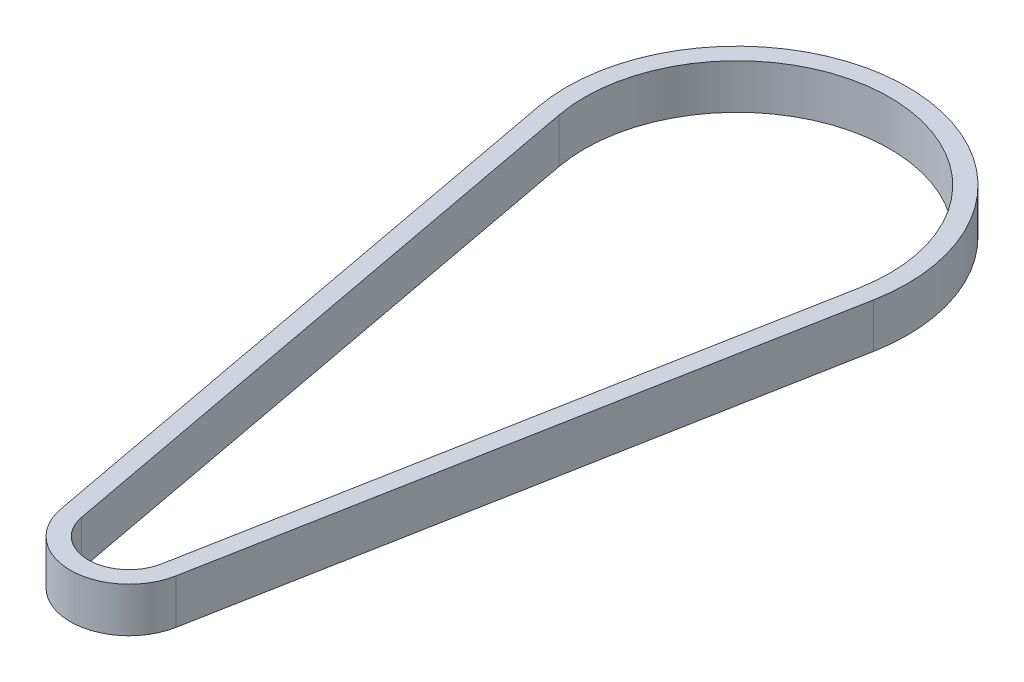
ISO-10303-21;
HEADER;
FILE_DESCRIPTION(('STEP AP214'),'2;1');
FILE_NAME('part.step','',(''),(''),'','','');
FILE_SCHEMA(('AUTOMOTIVE_DESIGN { 1 0 10303 214 1 1 1 1 }'));
ENDSEC;
DATA;
#1=APPLICATION_CONTEXT('core data for automotive mechanical design processes');
#2=APPLICATION_PROTOCOL_DEFINITION('international standard','automotive_design',2000,#1);
#3=PRODUCT_CONTEXT('',#1,'mechanical');
#4=PRODUCT('Part','Part','',(#3));
#5=PRODUCT_RELATED_PRODUCT_CATEGORY('part','',(#4));
#6=PRODUCT_DEFINITION_FORMATION('','',#4);
#7=PRODUCT_DEFINITION_CONTEXT('part definition',#1,'design');
#8=PRODUCT_DEFINITION('design','',#6,#7);
#9=PRODUCT_DEFINITION_SHAPE('','',#8);
#10=(LENGTH_UNIT() NAMED_UNIT(*) SI_UNIT(.MILLI.,.METRE.));
#11=(NAMED_UNIT(*) PLANE_ANGLE_UNIT() SI_UNIT($,.RADIAN.));
#12=(NAMED_UNIT(*) SI_UNIT($,.STERADIAN.) SOLID_ANGLE_UNIT());
#13=UNCERTAINTY_MEASURE_WITH_UNIT(LENGTH_MEASURE(1.E-05),#10,'distance_accuracy_value','');
#14=(GEOMETRIC_REPRESENTATION_CONTEXT(3) GLOBAL_UNCERTAINTY_ASSIGNED_CONTEXT((#13)) GLOBAL_UNIT_ASSIGNED_CONTEXT((#10,
#11,#12)) REPRESENTATION_CONTEXT('',''));
#15=CARTESIAN_POINT('',(0.,0.,0.));
#16=DIRECTION('',(0.,0.,1.));
#17=DIRECTION('',(1.,0.,0.));
#18=AXIS2_PLACEMENT_3D('',#15,#16,#17);
#19=CARTESIAN_POINT('',(-187.507179986424,50.,35.0231345475911));
#20=DIRECTION('',(0.982999632956353,0.,-0.183607520564042));
#21=DIRECTION('',(-0.183607520564042,0.,-0.982999632956353));
#22=AXIS2_PLACEMENT_3D('',#19,#20,#21);
#23=PLANE('',#22);
#24=DIRECTION('',(0.183607520564042,0.,0.982999632956353));
#25=VECTOR('',#24,1.);
#26=CARTESIAN_POINT('',(-187.507179986424,0.,35.0231345475911));
#27=LINE('',#26,#25);
#28=CARTESIAN_POINT('',(-187.507179986424,0.,35.0231345475911));
#29=VERTEX_POINT('',#28);
#30=CARTESIAN_POINT('',(-64.63222586688,0.,692.872194477086));
#31=VERTEX_POINT('',#30);
#32=EDGE_CURVE('E139',#29,#31,#27,.T.);
#33=ORIENTED_EDGE('',*,*,#32,.T.);
#34=DIRECTION('',(0.,-1.,0.));
#35=VECTOR('',#34,1.);
#36=CARTESIAN_POINT('',(-64.63222586688,50.,692.872194477086));
#37=LINE('',#36,#35);
#38=CARTESIAN_POINT('',(-64.63222586688,50.,692.872194477086));
#39=VERTEX_POINT('',#38);
#40=EDGE_CURVE('E11',#39,#31,#37,.T.);
#41=ORIENTED_EDGE('',*,*,#40,.F.);
#42=DIRECTION('',(0.183607520564042,0.,0.982999632956353));
#43=VECTOR('',#42,1.);
#44=CARTESIAN_POINT('',(-187.507179986424,50.,35.0231345475911));
#45=LINE('',#44,#43);
#46=CARTESIAN_POINT('',(-187.507179986424,50.,35.0231345475911));
#47=VERTEX_POINT('',#46);
#48=EDGE_CURVE('E110',#47,#39,#45,.T.);
#49=ORIENTED_EDGE('',*,*,#48,.F.);
#50=DIRECTION('',(0.,-1.,0.));
#51=VECTOR('',#50,1.);
#52=CARTESIAN_POINT('',(-187.507179986424,50.,35.0231345475911));
#53=LINE('',#52,#51);
#54=EDGE_CURVE('E147',#47,#29,#53,.T.);
#55=ORIENTED_EDGE('',*,*,#54,.T.);
#56=EDGE_LOOP('',(#33,#41,#49,#55));
#57=FACE_BOUND('',#56,.T.);
#58=ADVANCED_FACE('F33',(#57),#23,.F.);
#59=CARTESIAN_POINT('',(0.,50.,680.8));
#60=DIRECTION('',(0.,-1.,0.));
#61=DIRECTION('',(0.,0.,-1.));
#62=AXIS2_PLACEMENT_3D('',#59,#60,#61);
#63=CYLINDRICAL_SURFACE('',#62,65.7499999999999);
#64=CARTESIAN_POINT('',(0.,0.,680.8));
#65=DIRECTION('',(0.,1.,0.));
#66=DIRECTION('',(0.,0.,1.));
#67=AXIS2_PLACEMENT_3D('',#64,#65,#66);
#68=CIRCLE('',#67,65.7499999999999);
#69=CARTESIAN_POINT('',(64.6322258668803,0.,692.872194477086));
#70=VERTEX_POINT('',#69);
#71=EDGE_CURVE('E116',#31,#70,#68,.T.);
#72=ORIENTED_EDGE('',*,*,#71,.T.);
#73=DIRECTION('',(0.,-1.,0.));
#74=VECTOR('',#73,1.);
#75=CARTESIAN_POINT('',(64.6322258668803,50.,692.872194477086));
#76=LINE('',#75,#74);
#77=CARTESIAN_POINT('',(64.6322258668803,50.,692.872194477086));
#78=VERTEX_POINT('',#77);
#79=EDGE_CURVE('E43',#78,#70,#76,.T.);
#80=ORIENTED_EDGE('',*,*,#79,.F.);
#81=CARTESIAN_POINT('',(0.,50.,680.8));
#82=DIRECTION('',(0.,1.,0.));
#83=DIRECTION('',(0.,0.,1.));
#84=AXIS2_PLACEMENT_3D('',#81,#82,#83);
#85=CIRCLE('',#84,65.7499999999999);
#86=EDGE_CURVE('E104',#39,#78,#85,.T.);
#87=ORIENTED_EDGE('',*,*,#86,.F.);
#88=ORIENTED_EDGE('',*,*,#40,.T.);
#89=EDGE_LOOP('',(#72,#80,#87,#88));
#90=FACE_BOUND('',#89,.T.);
#91=ADVANCED_FACE('F115',(#90),#63,.T.);
#92=CARTESIAN_POINT('',(187.507179986424,50.,35.023134547591));
#93=DIRECTION('',(0.982999632956353,0.,0.183607520564042));
#94=DIRECTION('',(0.183607520564042,0.,-0.982999632956353));
#95=AXIS2_PLACEMENT_3D('',#92,#93,#94);
#96=PLANE('',#95);
#97=DIRECTION('',(-0.183607520564042,0.,0.982999632956353));
#98=VECTOR('',#97,1.);
#99=CARTESIAN_POINT('',(187.507179986424,0.,35.023134547591));
#100=LINE('',#99,#98);
#101=CARTESIAN_POINT('',(187.507179986424,0.,35.0231345475912));
#102=VERTEX_POINT('',#101);
#103=EDGE_CURVE('E143',#102,#70,#100,.T.);
#104=ORIENTED_EDGE('',*,*,#103,.F.);
#105=DIRECTION('',(0.,-1.,0.));
#106=VECTOR('',#105,1.);
#107=CARTESIAN_POINT('',(187.507179986424,50.,35.0231345475912));
#108=LINE('',#107,#106);
#109=CARTESIAN_POINT('',(187.507179986424,50.,35.0231345475912));
#110=VERTEX_POINT('',#109);
#111=EDGE_CURVE('E80',#110,#102,#108,.T.);
#112=ORIENTED_EDGE('',*,*,#111,.F.);
#113=DIRECTION('',(-0.183607520564042,0.,0.982999632956353));
#114=VECTOR('',#113,1.);
#115=CARTESIAN_POINT('',(187.507179986424,50.,35.023134547591));
#116=LINE('',#115,#114);
#117=EDGE_CURVE('E108',#110,#78,#116,.T.);
#118=ORIENTED_EDGE('',*,*,#117,.T.);
#119=ORIENTED_EDGE('',*,*,#79,.T.);
#120=EDGE_LOOP('',(#104,#112,#118,#119));
#121=FACE_BOUND('',#120,.T.);
#122=ADVANCED_FACE('F121',(#121),#96,.T.);
#123=CARTESIAN_POINT('',(0.,50.,680.8));
#124=DIRECTION('',(0.,-1.,0.));
#125=DIRECTION('',(0.,0.,-1.));
#126=AXIS2_PLACEMENT_3D('',#123,#124,#125);
#127=CYLINDRICAL_SURFACE('',#126,45.75);
#128=CARTESIAN_POINT('',(0.,0.,680.8));
#129=DIRECTION('',(0.,1.,0.));
#130=DIRECTION('',(0.,0.,1.));
#131=AXIS2_PLACEMENT_3D('',#128,#129,#130);
#132=CIRCLE('',#131,45.75);
#133=CARTESIAN_POINT('',(-44.972233207753,0.,689.200044065805));
#134=VERTEX_POINT('',#133);
#135=CARTESIAN_POINT('',(44.9722332077532,0.,689.200044065805));
#136=VERTEX_POINT('',#135);
#137=EDGE_CURVE('E127',#134,#136,#132,.T.);
#138=ORIENTED_EDGE('',*,*,#137,.F.);
#139=DIRECTION('',(0.,-1.,0.));
#140=VECTOR('',#139,1.);
#141=CARTESIAN_POINT('',(-44.972233207753,50.,689.200044065805));
#142=LINE('',#141,#140);
#143=CARTESIAN_POINT('',(-44.972233207753,50.,689.200044065805));
#144=VERTEX_POINT('',#143);
#145=EDGE_CURVE('E37',#144,#134,#142,.T.);
#146=ORIENTED_EDGE('',*,*,#145,.F.);
#147=CARTESIAN_POINT('',(0.,50.,680.8));
#148=DIRECTION('',(0.,1.,0.));
#149=DIRECTION('',(0.,0.,1.));
#150=AXIS2_PLACEMENT_3D('',#147,#148,#149);
#151=CIRCLE('',#150,45.75);
#152=CARTESIAN_POINT('',(44.9722332077532,50.,689.200044065805));
#153=VERTEX_POINT('',#152);
#154=EDGE_CURVE('E146',#144,#153,#151,.T.);
#155=ORIENTED_EDGE('',*,*,#154,.T.);
#156=DIRECTION('',(0.,-1.,0.));
#157=VECTOR('',#156,1.);
#158=CARTESIAN_POINT('',(44.9722332077532,50.,689.200044065805));
#159=LINE('',#158,#157);
#160=EDGE_CURVE('E123',#153,#136,#159,.T.);
#161=ORIENTED_EDGE('',*,*,#160,.T.);
#162=EDGE_LOOP('',(#138,#146,#155,#161));
#163=FACE_BOUND('',#162,.T.);
#164=ADVANCED_FACE('F35',(#163),#127,.F.);
#165=CARTESIAN_POINT('',(-167.847187327297,50.,31.3509841363102));
#166=DIRECTION('',(0.982999632956353,0.,-0.183607520564042));
#167=DIRECTION('',(-0.183607520564042,0.,-0.982999632956353));
#168=AXIS2_PLACEMENT_3D('',#165,#166,#167);
#169=PLANE('',#168);
#170=DIRECTION('',(0.183607520564042,0.,0.982999632956353));
#171=VECTOR('',#170,1.);
#172=CARTESIAN_POINT('',(-167.847187327297,0.,31.3509841363102));
#173=LINE('',#172,#171);
#174=CARTESIAN_POINT('',(-167.847187327297,0.,31.3509841363102));
#175=VERTEX_POINT('',#174);
#176=EDGE_CURVE('E130',#175,#134,#173,.T.);
#177=ORIENTED_EDGE('',*,*,#176,.F.);
#178=DIRECTION('',(0.,-1.,0.));
#179=VECTOR('',#178,1.);
#180=CARTESIAN_POINT('',(-167.847187327297,50.,31.3509841363102));
#181=LINE('',#180,#179);
#182=CARTESIAN_POINT('',(-167.847187327297,50.,31.3509841363102));
#183=VERTEX_POINT('',#182);
#184=EDGE_CURVE('E152',#183,#175,#181,.T.);
#185=ORIENTED_EDGE('',*,*,#184,.F.);
#186=DIRECTION('',(0.183607520564042,0.,0.982999632956353));
#187=VECTOR('',#186,1.);
#188=CARTESIAN_POINT('',(-167.847187327297,50.,31.3509841363102));
#189=LINE('',#188,#187);
#190=EDGE_CURVE('E161',#183,#144,#189,.T.);
#191=ORIENTED_EDGE('',*,*,#190,.T.);
#192=ORIENTED_EDGE('',*,*,#145,.T.);
#193=EDGE_LOOP('',(#177,#185,#191,#192));
#194=FACE_BOUND('',#193,.T.);
#195=ADVANCED_FACE('F159',(#194),#169,.T.);
#196=CARTESIAN_POINT('',(0.,50.,0.));
#197=DIRECTION('',(0.,-1.,0.));
#198=DIRECTION('',(0.,0.,-1.));
#199=AXIS2_PLACEMENT_3D('',#196,#197,#198);
#200=CYLINDRICAL_SURFACE('',#199,170.75);
#201=CARTESIAN_POINT('',(0.,0.,0.));
#202=DIRECTION('',(0.,1.,0.));
#203=DIRECTION('',(0.,0.,1.));
#204=AXIS2_PLACEMENT_3D('',#201,#202,#203);
#205=CIRCLE('',#204,170.75);
#206=CARTESIAN_POINT('',(167.847187327297,0.,31.3509841363102));
#207=VERTEX_POINT('',#206);
#208=EDGE_CURVE('E133',#207,#175,#205,.T.);
#209=ORIENTED_EDGE('',*,*,#208,.F.);
#210=DIRECTION('',(0.,-1.,0.));
#211=VECTOR('',#210,1.);
#212=CARTESIAN_POINT('',(167.847187327297,50.,31.3509841363102));
#213=LINE('',#212,#211);
#214=CARTESIAN_POINT('',(167.847187327297,50.,31.3509841363102));
#215=VERTEX_POINT('',#214);
#216=EDGE_CURVE('E151',#215,#207,#213,.T.);
#217=ORIENTED_EDGE('',*,*,#216,.F.);
#218=CARTESIAN_POINT('',(0.,50.,0.));
#219=DIRECTION('',(0.,1.,0.));
#220=DIRECTION('',(0.,0.,1.));
#221=AXIS2_PLACEMENT_3D('',#218,#219,#220);
#222=CIRCLE('',#221,170.75);
#223=EDGE_CURVE('E170',#215,#183,#222,.T.);
#224=ORIENTED_EDGE('',*,*,#223,.T.);
#225=ORIENTED_EDGE('',*,*,#184,.T.);
#226=EDGE_LOOP('',(#209,#217,#224,#225));
#227=FACE_BOUND('',#226,.T.);
#228=ADVANCED_FACE('F167',(#227),#200,.F.);
#229=CARTESIAN_POINT('',(167.847187327297,50.,31.3509841363102));
#230=DIRECTION('',(0.982999632956353,0.,0.183607520564042));
#231=DIRECTION('',(0.183607520564042,0.,-0.982999632956353));
#232=AXIS2_PLACEMENT_3D('',#229,#230,#231);
#233=PLANE('',#232);
#234=DIRECTION('',(-0.183607520564042,0.,0.982999632956353));
#235=VECTOR('',#234,1.);
#236=CARTESIAN_POINT('',(167.847187327297,0.,31.3509841363102));
#237=LINE('',#236,#235);
#238=EDGE_CURVE('E136',#207,#136,#237,.T.);
#239=ORIENTED_EDGE('',*,*,#238,.T.);
#240=ORIENTED_EDGE('',*,*,#160,.F.);
#241=DIRECTION('',(-0.183607520564042,0.,0.982999632956353));
#242=VECTOR('',#241,1.);
#243=CARTESIAN_POINT('',(167.847187327297,50.,31.3509841363102));
#244=LINE('',#243,#242);
#245=EDGE_CURVE('E172',#215,#153,#244,.T.);
#246=ORIENTED_EDGE('',*,*,#245,.F.);
#247=ORIENTED_EDGE('',*,*,#216,.T.);
#248=EDGE_LOOP('',(#239,#240,#246,#247));
#249=FACE_BOUND('',#248,.T.);
#250=ADVANCED_FACE('F173',(#249),#233,.F.);
#251=CARTESIAN_POINT('',(0.,50.,0.));
#252=DIRECTION('',(0.,-1.,0.));
#253=DIRECTION('',(0.,0.,-1.));
#254=AXIS2_PLACEMENT_3D('',#251,#252,#253);
#255=CYLINDRICAL_SURFACE('',#254,190.75);
#256=CARTESIAN_POINT('',(0.,0.,0.));
#257=DIRECTION('',(0.,1.,0.));
#258=DIRECTION('',(0.,0.,1.));
#259=AXIS2_PLACEMENT_3D('',#256,#257,#258);
#260=CIRCLE('',#259,190.75);
#261=EDGE_CURVE('E83',#102,#29,#260,.T.);
#262=ORIENTED_EDGE('',*,*,#261,.T.);
#263=ORIENTED_EDGE('',*,*,#54,.F.);
#264=CARTESIAN_POINT('',(0.,50.,0.));
#265=DIRECTION('',(0.,1.,0.));
#266=DIRECTION('',(0.,0.,1.));
#267=AXIS2_PLACEMENT_3D('',#264,#265,#266);
#268=CIRCLE('',#267,190.75);
#269=EDGE_CURVE('E52',#110,#47,#268,.T.);
#270=ORIENTED_EDGE('',*,*,#269,.F.);
#271=ORIENTED_EDGE('',*,*,#111,.T.);
#272=EDGE_LOOP('',(#262,#263,#270,#271));
#273=FACE_BOUND('',#272,.T.);
#274=ADVANCED_FACE('F180',(#273),#255,.T.);
#275=CARTESIAN_POINT('',(0.,50.,0.));
#276=DIRECTION('',(0.,1.,0.));
#277=DIRECTION('',(0.,0.,1.));
#278=AXIS2_PLACEMENT_3D('',#275,#276,#277);
#279=PLANE('',#278);
#280=ORIENTED_EDGE('',*,*,#154,.F.);
#281=ORIENTED_EDGE('',*,*,#190,.F.);
#282=ORIENTED_EDGE('',*,*,#223,.F.);
#283=ORIENTED_EDGE('',*,*,#245,.T.);
#284=EDGE_LOOP('',(#280,#281,#282,#283));
#285=FACE_BOUND('',#284,.T.);
#286=ORIENTED_EDGE('',*,*,#48,.T.);
#287=ORIENTED_EDGE('',*,*,#86,.T.);
#288=ORIENTED_EDGE('',*,*,#117,.F.);
#289=ORIENTED_EDGE('',*,*,#269,.T.);
#290=EDGE_LOOP('',(#286,#287,#288,#289));
#291=FACE_BOUND('',#290,.T.);
#292=ADVANCED_FACE('F106',(#285,#291),#279,.T.);
#293=CARTESIAN_POINT('',(0.,0.,0.));
#294=DIRECTION('',(0.,1.,0.));
#295=DIRECTION('',(0.,0.,1.));
#296=AXIS2_PLACEMENT_3D('',#293,#294,#295);
#297=PLANE('',#296);
#298=ORIENTED_EDGE('',*,*,#137,.T.);
#299=ORIENTED_EDGE('',*,*,#238,.F.);
#300=ORIENTED_EDGE('',*,*,#208,.T.);
#301=ORIENTED_EDGE('',*,*,#176,.T.);
#302=EDGE_LOOP('',(#298,#299,#300,#301));
#303=FACE_BOUND('',#302,.T.);
#304=ORIENTED_EDGE('',*,*,#32,.F.);
#305=ORIENTED_EDGE('',*,*,#261,.F.);
#306=ORIENTED_EDGE('',*,*,#103,.T.);
#307=ORIENTED_EDGE('',*,*,#71,.F.);
#308=EDGE_LOOP('',(#304,#305,#306,#307));
#309=FACE_BOUND('',#308,.T.);
#310=ADVANCED_FACE('F165',(#303,#309),#297,.F.);
#311=CLOSED_SHELL('',(#58,#91,#122,#164,#195,#228,#250,#274,#292,#310));
#312=MANIFOLD_SOLID_BREP('B2',#311);
#313=ADVANCED_BREP_SHAPE_REPRESENTATION('',(#18,#312),#14);
#314=SHAPE_DEFINITION_REPRESENTATION(#9,#313);
ENDSEC;
END-ISO-10303-21;
